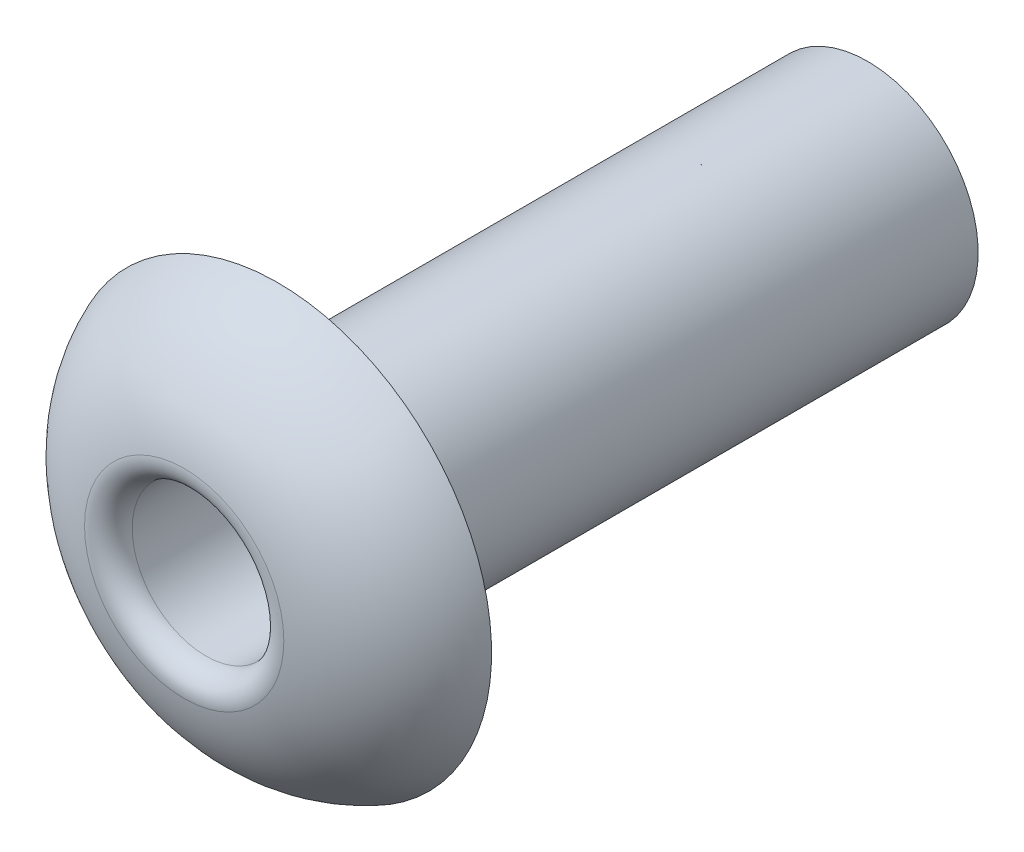
ISO-10303-21;
HEADER;
FILE_DESCRIPTION(('STEP AP214'),'2;1');
FILE_NAME('part.step','',(''),(''),'','','');
FILE_SCHEMA(('AUTOMOTIVE_DESIGN { 1 0 10303 214 1 1 1 1 }'));
ENDSEC;
DATA;
#1=APPLICATION_CONTEXT('core data for automotive mechanical design processes');
#2=APPLICATION_PROTOCOL_DEFINITION('international standard','automotive_design',2000,#1);
#3=PRODUCT_CONTEXT('',#1,'mechanical');
#4=PRODUCT('Part','Part','',(#3));
#5=PRODUCT_RELATED_PRODUCT_CATEGORY('part','',(#4));
#6=PRODUCT_DEFINITION_FORMATION('','',#4);
#7=PRODUCT_DEFINITION_CONTEXT('part definition',#1,'design');
#8=PRODUCT_DEFINITION('design','',#6,#7);
#9=PRODUCT_DEFINITION_SHAPE('','',#8);
#10=(LENGTH_UNIT() NAMED_UNIT(*) SI_UNIT(.MILLI.,.METRE.));
#11=(NAMED_UNIT(*) PLANE_ANGLE_UNIT() SI_UNIT($,.RADIAN.));
#12=(NAMED_UNIT(*) SI_UNIT($,.STERADIAN.) SOLID_ANGLE_UNIT());
#13=UNCERTAINTY_MEASURE_WITH_UNIT(LENGTH_MEASURE(1.E-05),#10,'distance_accuracy_value','');
#14=(GEOMETRIC_REPRESENTATION_CONTEXT(3) GLOBAL_UNCERTAINTY_ASSIGNED_CONTEXT((#13)) GLOBAL_UNIT_ASSIGNED_CONTEXT((#10,
#11,#12)) REPRESENTATION_CONTEXT('',''));
#15=CARTESIAN_POINT('',(0.,0.,0.));
#16=DIRECTION('',(0.,0.,1.));
#17=DIRECTION('',(1.,0.,0.));
#18=AXIS2_PLACEMENT_3D('',#15,#16,#17);
#19=CARTESIAN_POINT('',(0.,0.,-0.738461538461538));
#20=DIRECTION('',(0.,0.,-1.));
#21=DIRECTION('',(-1.,0.,0.));
#22=AXIS2_PLACEMENT_3D('',#19,#20,#21);
#23=DEGENERATE_TOROIDAL_SURFACE('',#22,1.,2.03846153846154,.T.);
#24=CARTESIAN_POINT('',(0.,0.,1.2694187799706));
#25=DIRECTION('',(0.,0.,-1.));
#26=DIRECTION('',(-1.,0.,0.));
#27=AXIS2_PLACEMENT_3D('',#24,#25,#26);
#28=CIRCLE('',#27,1.35176991150443);
#29=CARTESIAN_POINT('',(-1.35176991150443,0.,1.2694187799706));
#30=VERTEX_POINT('',#29);
#31=EDGE_CURVE('E39',#30,#30,#28,.T.);
#32=ORIENTED_EDGE('',*,*,#31,.T.);
#33=EDGE_LOOP('',(#32));
#34=FACE_BOUND('',#33,.T.);
#35=CARTESIAN_POINT('',(0.,0.,0.));
#36=DIRECTION('',(0.,0.,-1.));
#37=DIRECTION('',(-1.,0.,0.));
#38=AXIS2_PLACEMENT_3D('',#35,#36,#37);
#39=CIRCLE('',#38,2.9);
#40=CARTESIAN_POINT('',(-2.9,0.,0.));
#41=VERTEX_POINT('',#40);
#42=EDGE_CURVE('E55',#41,#41,#39,.T.);
#43=ORIENTED_EDGE('',*,*,#42,.F.);
#44=EDGE_LOOP('',(#43));
#45=FACE_BOUND('',#44,.T.);
#46=ADVANCED_FACE('F32',(#34,#45),#23,.T.);
#47=CARTESIAN_POINT('',(0.,0.,-4.));
#48=DIRECTION('',(0.,0.,-1.));
#49=DIRECTION('',(-1.,0.,0.));
#50=AXIS2_PLACEMENT_3D('',#47,#48,#49);
#51=CYLINDRICAL_SURFACE('',#50,1.);
#52=CARTESIAN_POINT('',(0.,0.,0.973919412352286));
#53=DIRECTION('',(0.,0.,1.));
#54=DIRECTION('',(1.,0.,0.));
#55=AXIS2_PLACEMENT_3D('',#52,#53,#54);
#56=CIRCLE('',#55,1.);
#57=CARTESIAN_POINT('',(1.,0.,0.973919412352286));
#58=VERTEX_POINT('',#57);
#59=EDGE_CURVE('E10',#58,#58,#56,.T.);
#60=ORIENTED_EDGE('',*,*,#59,.T.);
#61=EDGE_LOOP('',(#60));
#62=FACE_BOUND('',#61,.T.);
#63=CARTESIAN_POINT('',(0.,0.,-8.));
#64=DIRECTION('',(0.,0.,-1.));
#65=DIRECTION('',(-1.,0.,0.));
#66=AXIS2_PLACEMENT_3D('',#63,#64,#65);
#67=CIRCLE('',#66,1.);
#68=CARTESIAN_POINT('',(-1.,0.,-8.));
#69=VERTEX_POINT('',#68);
#70=EDGE_CURVE('E43',#69,#69,#67,.T.);
#71=ORIENTED_EDGE('',*,*,#70,.T.);
#72=EDGE_LOOP('',(#71));
#73=FACE_BOUND('',#72,.T.);
#74=ADVANCED_FACE('F63',(#62,#73),#51,.F.);
#75=CARTESIAN_POINT('',(0.,1.5,-8.));
#76=DIRECTION('',(0.,0.,-1.));
#77=DIRECTION('',(-1.,0.,0.));
#78=AXIS2_PLACEMENT_3D('',#75,#76,#77);
#79=PLANE('',#78);
#80=CARTESIAN_POINT('',(0.,0.,-8.));
#81=DIRECTION('',(0.,0.,-1.));
#82=DIRECTION('',(-1.,0.,0.));
#83=AXIS2_PLACEMENT_3D('',#80,#81,#82);
#84=CIRCLE('',#83,1.5);
#85=CARTESIAN_POINT('',(-1.5,0.,-8.));
#86=VERTEX_POINT('',#85);
#87=EDGE_CURVE('E47',#86,#86,#84,.T.);
#88=ORIENTED_EDGE('',*,*,#87,.T.);
#89=EDGE_LOOP('',(#88));
#90=FACE_BOUND('',#89,.T.);
#91=ORIENTED_EDGE('',*,*,#70,.F.);
#92=EDGE_LOOP('',(#91));
#93=FACE_BOUND('',#92,.T.);
#94=ADVANCED_FACE('F67',(#90,#93),#79,.T.);
#95=CARTESIAN_POINT('',(0.,0.,-4.));
#96=DIRECTION('',(0.,0.,-1.));
#97=DIRECTION('',(-1.,0.,0.));
#98=AXIS2_PLACEMENT_3D('',#95,#96,#97);
#99=CYLINDRICAL_SURFACE('',#98,1.5);
#100=CARTESIAN_POINT('',(0.,0.,0.));
#101=DIRECTION('',(0.,0.,-1.));
#102=DIRECTION('',(-1.,0.,0.));
#103=AXIS2_PLACEMENT_3D('',#100,#101,#102);
#104=CIRCLE('',#103,1.5);
#105=CARTESIAN_POINT('',(-1.5,0.,0.));
#106=VERTEX_POINT('',#105);
#107=EDGE_CURVE('E52',#106,#106,#104,.T.);
#108=ORIENTED_EDGE('',*,*,#107,.T.);
#109=EDGE_LOOP('',(#108));
#110=FACE_BOUND('',#109,.T.);
#111=ORIENTED_EDGE('',*,*,#87,.F.);
#112=EDGE_LOOP('',(#111));
#113=FACE_BOUND('',#112,.T.);
#114=ADVANCED_FACE('F72',(#110,#113),#99,.T.);
#115=CARTESIAN_POINT('',(0.,1.5,0.));
#116=DIRECTION('',(0.,0.,-1.));
#117=DIRECTION('',(-1.,0.,0.));
#118=AXIS2_PLACEMENT_3D('',#115,#116,#117);
#119=PLANE('',#118);
#120=ORIENTED_EDGE('',*,*,#42,.T.);
#121=EDGE_LOOP('',(#120));
#122=FACE_BOUND('',#121,.T.);
#123=ORIENTED_EDGE('',*,*,#107,.F.);
#124=EDGE_LOOP('',(#123));
#125=FACE_BOUND('',#124,.T.);
#126=ADVANCED_FACE('F59',(#122,#125),#119,.T.);
#127=CARTESIAN_POINT('',(0.,0.,0.973919412352286));
#128=DIRECTION('',(0.,0.,1.));
#129=DIRECTION('',(1.,0.,0.));
#130=AXIS2_PLACEMENT_3D('',#127,#128,#129);
#131=TOROIDAL_SURFACE('',#130,1.3,0.3);
#132=ORIENTED_EDGE('',*,*,#59,.F.);
#133=EDGE_LOOP('',(#132));
#134=FACE_BOUND('',#133,.T.);
#135=ORIENTED_EDGE('',*,*,#31,.F.);
#136=EDGE_LOOP('',(#135));
#137=FACE_BOUND('',#136,.T.);
#138=ADVANCED_FACE('F34',(#134,#137),#131,.T.);
#139=CLOSED_SHELL('',(#46,#74,#94,#114,#126,#138));
#140=MANIFOLD_SOLID_BREP('B2',#139);
#141=ADVANCED_BREP_SHAPE_REPRESENTATION('',(#18,#140),#14);
#142=SHAPE_DEFINITION_REPRESENTATION(#9,#141);
ENDSEC;
END-ISO-10303-21;
